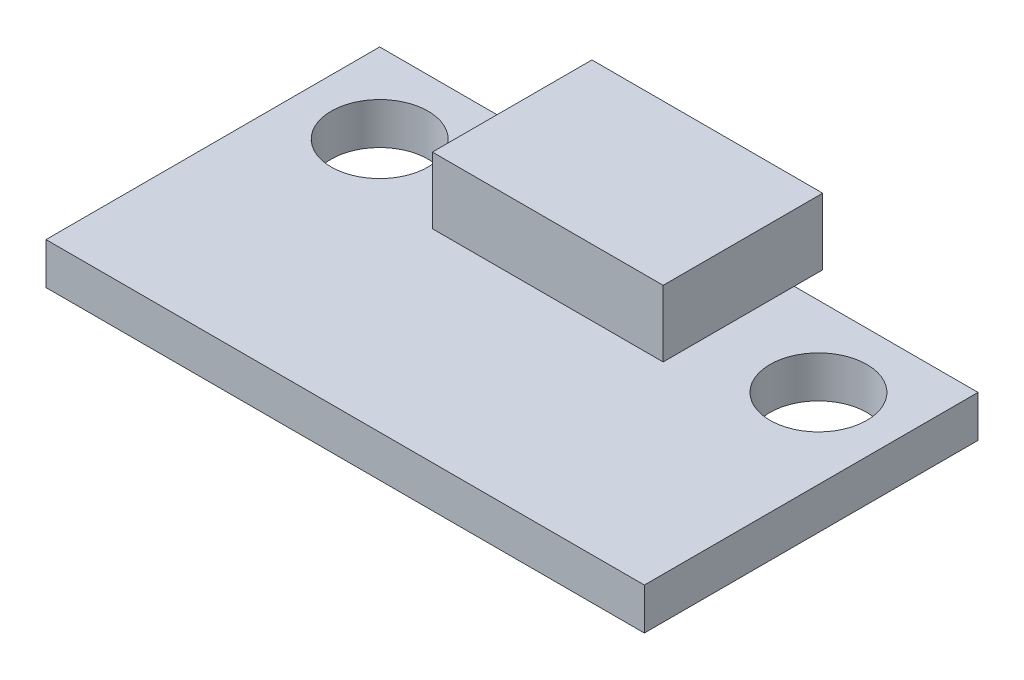
ISO-10303-21;
HEADER;
FILE_DESCRIPTION(('STEP AP214'),'2;1');
FILE_NAME('part.step','',(''),(''),'','','');
FILE_SCHEMA(('AUTOMOTIVE_DESIGN { 1 0 10303 214 1 1 1 1 }'));
ENDSEC;
DATA;
#1=APPLICATION_CONTEXT('core data for automotive mechanical design processes');
#2=APPLICATION_PROTOCOL_DEFINITION('international standard','automotive_design',2000,#1);
#3=PRODUCT_CONTEXT('',#1,'mechanical');
#4=PRODUCT('Part','Part','',(#3));
#5=PRODUCT_RELATED_PRODUCT_CATEGORY('part','',(#4));
#6=PRODUCT_DEFINITION_FORMATION('','',#4);
#7=PRODUCT_DEFINITION_CONTEXT('part definition',#1,'design');
#8=PRODUCT_DEFINITION('design','',#6,#7);
#9=PRODUCT_DEFINITION_SHAPE('','',#8);
#10=(LENGTH_UNIT() NAMED_UNIT(*) SI_UNIT(.MILLI.,.METRE.));
#11=(NAMED_UNIT(*) PLANE_ANGLE_UNIT() SI_UNIT($,.RADIAN.));
#12=(NAMED_UNIT(*) SI_UNIT($,.STERADIAN.) SOLID_ANGLE_UNIT());
#13=UNCERTAINTY_MEASURE_WITH_UNIT(LENGTH_MEASURE(1.E-05),#10,'distance_accuracy_value','');
#14=(GEOMETRIC_REPRESENTATION_CONTEXT(3) GLOBAL_UNCERTAINTY_ASSIGNED_CONTEXT((#13)) GLOBAL_UNIT_ASSIGNED_CONTEXT((#10,
#11,#12)) REPRESENTATION_CONTEXT('',''));
#15=CARTESIAN_POINT('',(0.,0.,0.));
#16=DIRECTION('',(0.,0.,1.));
#17=DIRECTION('',(1.,0.,0.));
#18=AXIS2_PLACEMENT_3D('',#15,#16,#17);
#19=CARTESIAN_POINT('',(0.,1.46,0.));
#20=DIRECTION('',(0.,-1.,0.));
#21=DIRECTION('',(0.,0.,-1.));
#22=AXIS2_PLACEMENT_3D('',#19,#20,#21);
#23=PLANE('',#22);
#24=CARTESIAN_POINT('',(7.7,1.46,-3.055));
#25=DIRECTION('',(0.,1.,0.));
#26=DIRECTION('',(0.,0.,-1.));
#27=AXIS2_PLACEMENT_3D('',#24,#25,#26);
#28=CIRCLE('',#27,1.7);
#29=CARTESIAN_POINT('',(7.7,1.46,-4.755));
#30=VERTEX_POINT('',#29);
#31=EDGE_CURVE('E128',#30,#30,#28,.T.);
#32=ORIENTED_EDGE('',*,*,#31,.F.);
#33=EDGE_LOOP('',(#32));
#34=FACE_BOUND('',#33,.T.);
#35=CARTESIAN_POINT('',(-7.7,1.46,-3.055));
#36=DIRECTION('',(0.,1.,0.));
#37=DIRECTION('',(0.,0.,1.));
#38=AXIS2_PLACEMENT_3D('',#35,#36,#37);
#39=CIRCLE('',#38,1.7);
#40=CARTESIAN_POINT('',(-7.7,1.46,-1.355));
#41=VERTEX_POINT('',#40);
#42=EDGE_CURVE('E137',#41,#41,#39,.T.);
#43=ORIENTED_EDGE('',*,*,#42,.F.);
#44=EDGE_LOOP('',(#43));
#45=FACE_BOUND('',#44,.T.);
#46=DIRECTION('',(0.,0.,1.));
#47=VECTOR('',#46,1.);
#48=CARTESIAN_POINT('',(-4.05,1.46,-6.855));
#49=LINE('',#48,#47);
#50=CARTESIAN_POINT('',(-4.05,1.46,-5.855));
#51=VERTEX_POINT('',#50);
#52=CARTESIAN_POINT('',(-4.05,1.46,-1.255));
#53=VERTEX_POINT('',#52);
#54=EDGE_CURVE('E11',#51,#53,#49,.T.);
#55=ORIENTED_EDGE('',*,*,#54,.F.);
#56=DIRECTION('',(-1.,0.,0.));
#57=VECTOR('',#56,1.);
#58=CARTESIAN_POINT('',(10.5,1.46,-5.855));
#59=LINE('',#58,#57);
#60=CARTESIAN_POINT('',(-10.5,1.46,-5.855));
#61=VERTEX_POINT('',#60);
#62=EDGE_CURVE('E151',#51,#61,#59,.T.);
#63=ORIENTED_EDGE('',*,*,#62,.T.);
#64=DIRECTION('',(0.,0.,1.));
#65=VECTOR('',#64,1.);
#66=CARTESIAN_POINT('',(-10.5,1.46,-5.855));
#67=LINE('',#66,#65);
#68=CARTESIAN_POINT('',(-10.5,1.46,5.855));
#69=VERTEX_POINT('',#68);
#70=EDGE_CURVE('E143',#61,#69,#67,.T.);
#71=ORIENTED_EDGE('',*,*,#70,.T.);
#72=DIRECTION('',(1.,0.,0.));
#73=VECTOR('',#72,1.);
#74=CARTESIAN_POINT('',(10.5,1.46,5.855));
#75=LINE('',#74,#73);
#76=CARTESIAN_POINT('',(10.5,1.46,5.855));
#77=VERTEX_POINT('',#76);
#78=EDGE_CURVE('E146',#69,#77,#75,.T.);
#79=ORIENTED_EDGE('',*,*,#78,.T.);
#80=DIRECTION('',(0.,0.,-1.));
#81=VECTOR('',#80,1.);
#82=CARTESIAN_POINT('',(10.5,1.46,-5.855));
#83=LINE('',#82,#81);
#84=CARTESIAN_POINT('',(10.5,1.46,-5.855));
#85=VERTEX_POINT('',#84);
#86=EDGE_CURVE('E149',#77,#85,#83,.T.);
#87=ORIENTED_EDGE('',*,*,#86,.T.);
#88=CARTESIAN_POINT('',(4.05,1.46,-5.855));
#89=VERTEX_POINT('',#88);
#90=EDGE_CURVE('E152',#85,#89,#59,.T.);
#91=ORIENTED_EDGE('',*,*,#90,.T.);
#92=DIRECTION('',(0.,0.,-1.));
#93=VECTOR('',#92,1.);
#94=CARTESIAN_POINT('',(4.05,1.46,-6.855));
#95=LINE('',#94,#93);
#96=CARTESIAN_POINT('',(4.05,1.46,-1.255));
#97=VERTEX_POINT('',#96);
#98=EDGE_CURVE('E194',#97,#89,#95,.T.);
#99=ORIENTED_EDGE('',*,*,#98,.F.);
#100=DIRECTION('',(1.,0.,0.));
#101=VECTOR('',#100,1.);
#102=CARTESIAN_POINT('',(-4.05,1.46,-1.255));
#103=LINE('',#102,#101);
#104=EDGE_CURVE('E50',#53,#97,#103,.T.);
#105=ORIENTED_EDGE('',*,*,#104,.F.);
#106=EDGE_LOOP('',(#55,#63,#71,#79,#87,#91,#99,#105));
#107=FACE_BOUND('',#106,.T.);
#108=ADVANCED_FACE('F33',(#34,#45,#107),#23,.F.);
#109=CARTESIAN_POINT('',(0.,0.,0.));
#110=DIRECTION('',(0.,-1.,0.));
#111=DIRECTION('',(0.,0.,-1.));
#112=AXIS2_PLACEMENT_3D('',#109,#110,#111);
#113=PLANE('',#112);
#114=CARTESIAN_POINT('',(-7.7,0.,-3.055));
#115=DIRECTION('',(0.,1.,0.));
#116=DIRECTION('',(0.,0.,1.));
#117=AXIS2_PLACEMENT_3D('',#114,#115,#116);
#118=CIRCLE('',#117,1.7);
#119=CARTESIAN_POINT('',(-7.7,0.,-1.355));
#120=VERTEX_POINT('',#119);
#121=EDGE_CURVE('E135',#120,#120,#118,.T.);
#122=ORIENTED_EDGE('',*,*,#121,.T.);
#123=EDGE_LOOP('',(#122));
#124=FACE_BOUND('',#123,.T.);
#125=DIRECTION('',(0.,0.,1.));
#126=VECTOR('',#125,1.);
#127=CARTESIAN_POINT('',(-10.5,0.,-5.855));
#128=LINE('',#127,#126);
#129=CARTESIAN_POINT('',(-10.5,0.,-5.855));
#130=VERTEX_POINT('',#129);
#131=CARTESIAN_POINT('',(-10.5,0.,5.855));
#132=VERTEX_POINT('',#131);
#133=EDGE_CURVE('E140',#130,#132,#128,.T.);
#134=ORIENTED_EDGE('',*,*,#133,.F.);
#135=DIRECTION('',(-1.,0.,0.));
#136=VECTOR('',#135,1.);
#137=CARTESIAN_POINT('',(10.5,0.,-5.855));
#138=LINE('',#137,#136);
#139=CARTESIAN_POINT('',(10.5,0.,-5.855));
#140=VERTEX_POINT('',#139);
#141=EDGE_CURVE('E147',#140,#130,#138,.T.);
#142=ORIENTED_EDGE('',*,*,#141,.F.);
#143=DIRECTION('',(0.,0.,-1.));
#144=VECTOR('',#143,1.);
#145=CARTESIAN_POINT('',(10.5,0.,-5.855));
#146=LINE('',#145,#144);
#147=CARTESIAN_POINT('',(10.5,0.,5.855));
#148=VERTEX_POINT('',#147);
#149=EDGE_CURVE('E161',#148,#140,#146,.T.);
#150=ORIENTED_EDGE('',*,*,#149,.F.);
#151=DIRECTION('',(1.,0.,0.));
#152=VECTOR('',#151,1.);
#153=CARTESIAN_POINT('',(10.5,0.,5.855));
#154=LINE('',#153,#152);
#155=EDGE_CURVE('E159',#132,#148,#154,.T.);
#156=ORIENTED_EDGE('',*,*,#155,.F.);
#157=EDGE_LOOP('',(#134,#142,#150,#156));
#158=FACE_BOUND('',#157,.T.);
#159=CARTESIAN_POINT('',(7.7,0.,-3.055));
#160=DIRECTION('',(0.,1.,0.));
#161=DIRECTION('',(0.,0.,-1.));
#162=AXIS2_PLACEMENT_3D('',#159,#160,#161);
#163=CIRCLE('',#162,1.7);
#164=CARTESIAN_POINT('',(7.7,0.,-4.755));
#165=VERTEX_POINT('',#164);
#166=EDGE_CURVE('E125',#165,#165,#163,.T.);
#167=ORIENTED_EDGE('',*,*,#166,.T.);
#168=EDGE_LOOP('',(#167));
#169=FACE_BOUND('',#168,.T.);
#170=ADVANCED_FACE('F184',(#124,#158,#169),#113,.T.);
#171=CARTESIAN_POINT('',(-10.5,1.46,-5.855));
#172=DIRECTION('',(1.,0.,0.));
#173=DIRECTION('',(0.,0.,-1.));
#174=AXIS2_PLACEMENT_3D('',#171,#172,#173);
#175=PLANE('',#174);
#176=ORIENTED_EDGE('',*,*,#133,.T.);
#177=DIRECTION('',(0.,-1.,0.));
#178=VECTOR('',#177,1.);
#179=CARTESIAN_POINT('',(-10.5,1.46,5.855));
#180=LINE('',#179,#178);
#181=EDGE_CURVE('E37',#69,#132,#180,.T.);
#182=ORIENTED_EDGE('',*,*,#181,.F.);
#183=ORIENTED_EDGE('',*,*,#70,.F.);
#184=DIRECTION('',(0.,-1.,0.));
#185=VECTOR('',#184,1.);
#186=CARTESIAN_POINT('',(-10.5,1.46,-5.855));
#187=LINE('',#186,#185);
#188=EDGE_CURVE('E155',#61,#130,#187,.T.);
#189=ORIENTED_EDGE('',*,*,#188,.T.);
#190=EDGE_LOOP('',(#176,#182,#183,#189));
#191=FACE_BOUND('',#190,.T.);
#192=ADVANCED_FACE('F35',(#191),#175,.F.);
#193=CARTESIAN_POINT('',(10.5,1.46,5.855));
#194=DIRECTION('',(0.,0.,-1.));
#195=DIRECTION('',(-1.,0.,0.));
#196=AXIS2_PLACEMENT_3D('',#193,#194,#195);
#197=PLANE('',#196);
#198=ORIENTED_EDGE('',*,*,#155,.T.);
#199=DIRECTION('',(0.,-1.,0.));
#200=VECTOR('',#199,1.);
#201=CARTESIAN_POINT('',(10.5,1.46,5.855));
#202=LINE('',#201,#200);
#203=EDGE_CURVE('E168',#77,#148,#202,.T.);
#204=ORIENTED_EDGE('',*,*,#203,.F.);
#205=ORIENTED_EDGE('',*,*,#78,.F.);
#206=ORIENTED_EDGE('',*,*,#181,.T.);
#207=EDGE_LOOP('',(#198,#204,#205,#206));
#208=FACE_BOUND('',#207,.T.);
#209=ADVANCED_FACE('F177',(#208),#197,.F.);
#210=CARTESIAN_POINT('',(10.5,1.46,-5.855));
#211=DIRECTION('',(-1.,0.,0.));
#212=DIRECTION('',(0.,0.,1.));
#213=AXIS2_PLACEMENT_3D('',#210,#211,#212);
#214=PLANE('',#213);
#215=ORIENTED_EDGE('',*,*,#149,.T.);
#216=DIRECTION('',(0.,-1.,0.));
#217=VECTOR('',#216,1.);
#218=CARTESIAN_POINT('',(10.5,1.46,-5.855));
#219=LINE('',#218,#217);
#220=EDGE_CURVE('E166',#85,#140,#219,.T.);
#221=ORIENTED_EDGE('',*,*,#220,.F.);
#222=ORIENTED_EDGE('',*,*,#86,.F.);
#223=ORIENTED_EDGE('',*,*,#203,.T.);
#224=EDGE_LOOP('',(#215,#221,#222,#223));
#225=FACE_BOUND('',#224,.T.);
#226=ADVANCED_FACE('F187',(#225),#214,.F.);
#227=CARTESIAN_POINT('',(10.5,1.46,-5.855));
#228=DIRECTION('',(0.,0.,1.));
#229=DIRECTION('',(1.,0.,0.));
#230=AXIS2_PLACEMENT_3D('',#227,#228,#229);
#231=PLANE('',#230);
#232=ORIENTED_EDGE('',*,*,#141,.T.);
#233=ORIENTED_EDGE('',*,*,#188,.F.);
#234=ORIENTED_EDGE('',*,*,#62,.F.);
#235=EDGE_CURVE('E156',#89,#51,#59,.T.);
#236=ORIENTED_EDGE('',*,*,#235,.F.);
#237=ORIENTED_EDGE('',*,*,#90,.F.);
#238=ORIENTED_EDGE('',*,*,#220,.T.);
#239=EDGE_LOOP('',(#232,#233,#234,#236,#237,#238));
#240=FACE_BOUND('',#239,.T.);
#241=ADVANCED_FACE('F190',(#240),#231,.F.);
#242=CARTESIAN_POINT('',(-7.7,1.46,-3.055));
#243=DIRECTION('',(0.,-1.,0.));
#244=DIRECTION('',(0.,0.,-1.));
#245=AXIS2_PLACEMENT_3D('',#242,#243,#244);
#246=CYLINDRICAL_SURFACE('',#245,1.7);
#247=ORIENTED_EDGE('',*,*,#42,.T.);
#248=EDGE_LOOP('',(#247));
#249=FACE_BOUND('',#248,.T.);
#250=ORIENTED_EDGE('',*,*,#121,.F.);
#251=EDGE_LOOP('',(#250));
#252=FACE_BOUND('',#251,.T.);
#253=ADVANCED_FACE('F233',(#249,#252),#246,.F.);
#254=CARTESIAN_POINT('',(7.7,1.46,-3.055));
#255=DIRECTION('',(0.,-1.,0.));
#256=DIRECTION('',(0.,0.,-1.));
#257=AXIS2_PLACEMENT_3D('',#254,#255,#256);
#258=CYLINDRICAL_SURFACE('',#257,1.7);
#259=ORIENTED_EDGE('',*,*,#31,.T.);
#260=EDGE_LOOP('',(#259));
#261=FACE_BOUND('',#260,.T.);
#262=ORIENTED_EDGE('',*,*,#166,.F.);
#263=EDGE_LOOP('',(#262));
#264=FACE_BOUND('',#263,.T.);
#265=ADVANCED_FACE('F276',(#261,#264),#258,.F.);
#266=CARTESIAN_POINT('',(0.,1.46,0.));
#267=DIRECTION('',(0.,1.,0.));
#268=DIRECTION('',(0.,0.,1.));
#269=AXIS2_PLACEMENT_3D('',#266,#267,#268);
#270=PLANE('',#269);
#271=CARTESIAN_POINT('',(4.05,1.46,-6.855));
#272=VERTEX_POINT('',#271);
#273=EDGE_CURVE('E197',#89,#272,#95,.T.);
#274=ORIENTED_EDGE('',*,*,#273,.F.);
#275=ORIENTED_EDGE('',*,*,#235,.T.);
#276=CARTESIAN_POINT('',(-4.05,1.46,-6.855));
#277=VERTEX_POINT('',#276);
#278=EDGE_CURVE('E43',#277,#51,#49,.T.);
#279=ORIENTED_EDGE('',*,*,#278,.F.);
#280=DIRECTION('',(-1.,0.,0.));
#281=VECTOR('',#280,1.);
#282=CARTESIAN_POINT('',(-4.05,1.46,-6.855));
#283=LINE('',#282,#281);
#284=EDGE_CURVE('E121',#272,#277,#283,.T.);
#285=ORIENTED_EDGE('',*,*,#284,.F.);
#286=EDGE_LOOP('',(#274,#275,#279,#285));
#287=FACE_BOUND('',#286,.T.);
#288=ADVANCED_FACE('F198',(#287),#270,.F.);
#289=CARTESIAN_POINT('',(-4.05,3.79,-6.855));
#290=DIRECTION('',(1.,0.,0.));
#291=DIRECTION('',(0.,0.,-1.));
#292=AXIS2_PLACEMENT_3D('',#289,#290,#291);
#293=PLANE('',#292);
#294=ORIENTED_EDGE('',*,*,#278,.T.);
#295=ORIENTED_EDGE('',*,*,#54,.T.);
#296=DIRECTION('',(0.,-1.,0.));
#297=VECTOR('',#296,1.);
#298=CARTESIAN_POINT('',(-4.05,3.79,-1.255));
#299=LINE('',#298,#297);
#300=CARTESIAN_POINT('',(-4.05,3.79,-1.255));
#301=VERTEX_POINT('',#300);
#302=EDGE_CURVE('E106',#301,#53,#299,.T.);
#303=ORIENTED_EDGE('',*,*,#302,.F.);
#304=DIRECTION('',(0.,0.,1.));
#305=VECTOR('',#304,1.);
#306=CARTESIAN_POINT('',(-4.05,3.79,-6.855));
#307=LINE('',#306,#305);
#308=CARTESIAN_POINT('',(-4.05,3.79,-6.855));
#309=VERTEX_POINT('',#308);
#310=EDGE_CURVE('E112',#309,#301,#307,.T.);
#311=ORIENTED_EDGE('',*,*,#310,.F.);
#312=DIRECTION('',(0.,-1.,0.));
#313=VECTOR('',#312,1.);
#314=CARTESIAN_POINT('',(-4.05,3.79,-6.855));
#315=LINE('',#314,#313);
#316=EDGE_CURVE('E208',#309,#277,#315,.T.);
#317=ORIENTED_EDGE('',*,*,#316,.T.);
#318=EDGE_LOOP('',(#294,#295,#303,#311,#317));
#319=FACE_BOUND('',#318,.T.);
#320=ADVANCED_FACE('F124',(#319),#293,.F.);
#321=CARTESIAN_POINT('',(-4.05,3.79,-1.255));
#322=DIRECTION('',(0.,0.,-1.));
#323=DIRECTION('',(-1.,0.,0.));
#324=AXIS2_PLACEMENT_3D('',#321,#322,#323);
#325=PLANE('',#324);
#326=ORIENTED_EDGE('',*,*,#104,.T.);
#327=DIRECTION('',(0.,-1.,0.));
#328=VECTOR('',#327,1.);
#329=CARTESIAN_POINT('',(4.05,3.79,-1.255));
#330=LINE('',#329,#328);
#331=CARTESIAN_POINT('',(4.05,3.79,-1.255));
#332=VERTEX_POINT('',#331);
#333=EDGE_CURVE('E108',#332,#97,#330,.T.);
#334=ORIENTED_EDGE('',*,*,#333,.F.);
#335=DIRECTION('',(1.,0.,0.));
#336=VECTOR('',#335,1.);
#337=CARTESIAN_POINT('',(-4.05,3.79,-1.255));
#338=LINE('',#337,#336);
#339=EDGE_CURVE('E102',#301,#332,#338,.T.);
#340=ORIENTED_EDGE('',*,*,#339,.F.);
#341=ORIENTED_EDGE('',*,*,#302,.T.);
#342=EDGE_LOOP('',(#326,#334,#340,#341));
#343=FACE_BOUND('',#342,.T.);
#344=ADVANCED_FACE('F104',(#343),#325,.F.);
#345=CARTESIAN_POINT('',(4.05,3.79,-6.855));
#346=DIRECTION('',(-1.,0.,0.));
#347=DIRECTION('',(0.,0.,1.));
#348=AXIS2_PLACEMENT_3D('',#345,#346,#347);
#349=PLANE('',#348);
#350=ORIENTED_EDGE('',*,*,#98,.T.);
#351=ORIENTED_EDGE('',*,*,#273,.T.);
#352=DIRECTION('',(0.,-1.,0.));
#353=VECTOR('',#352,1.);
#354=CARTESIAN_POINT('',(4.05,3.79,-6.855));
#355=LINE('',#354,#353);
#356=CARTESIAN_POINT('',(4.05,3.79,-6.855));
#357=VERTEX_POINT('',#356);
#358=EDGE_CURVE('E130',#357,#272,#355,.T.);
#359=ORIENTED_EDGE('',*,*,#358,.F.);
#360=DIRECTION('',(0.,0.,-1.));
#361=VECTOR('',#360,1.);
#362=CARTESIAN_POINT('',(4.05,3.79,-6.855));
#363=LINE('',#362,#361);
#364=EDGE_CURVE('E111',#332,#357,#363,.T.);
#365=ORIENTED_EDGE('',*,*,#364,.F.);
#366=ORIENTED_EDGE('',*,*,#333,.T.);
#367=EDGE_LOOP('',(#350,#351,#359,#365,#366));
#368=FACE_BOUND('',#367,.T.);
#369=ADVANCED_FACE('F204',(#368),#349,.F.);
#370=CARTESIAN_POINT('',(-4.05,3.79,-6.855));
#371=DIRECTION('',(0.,0.,1.));
#372=DIRECTION('',(1.,0.,0.));
#373=AXIS2_PLACEMENT_3D('',#370,#371,#372);
#374=PLANE('',#373);
#375=ORIENTED_EDGE('',*,*,#284,.T.);
#376=ORIENTED_EDGE('',*,*,#316,.F.);
#377=DIRECTION('',(-1.,0.,0.));
#378=VECTOR('',#377,1.);
#379=CARTESIAN_POINT('',(-4.05,3.79,-6.855));
#380=LINE('',#379,#378);
#381=EDGE_CURVE('E117',#357,#309,#380,.T.);
#382=ORIENTED_EDGE('',*,*,#381,.F.);
#383=ORIENTED_EDGE('',*,*,#358,.T.);
#384=EDGE_LOOP('',(#375,#376,#382,#383));
#385=FACE_BOUND('',#384,.T.);
#386=ADVANCED_FACE('F210',(#385),#374,.F.);
#387=CARTESIAN_POINT('',(0.,3.79,0.));
#388=DIRECTION('',(0.,1.,0.));
#389=DIRECTION('',(0.,0.,1.));
#390=AXIS2_PLACEMENT_3D('',#387,#388,#389);
#391=PLANE('',#390);
#392=ORIENTED_EDGE('',*,*,#310,.T.);
#393=ORIENTED_EDGE('',*,*,#339,.T.);
#394=ORIENTED_EDGE('',*,*,#364,.T.);
#395=ORIENTED_EDGE('',*,*,#381,.T.);
#396=EDGE_LOOP('',(#392,#393,#394,#395));
#397=FACE_BOUND('',#396,.T.);
#398=ADVANCED_FACE('F115',(#397),#391,.T.);
#399=CLOSED_SHELL('',(#108,#170,#192,#209,#226,#241,#253,#265,#288,#320,#344,#369,#386,#398));
#400=MANIFOLD_SOLID_BREP('B2',#399);
#401=ADVANCED_BREP_SHAPE_REPRESENTATION('',(#18,#400),#14);
#402=SHAPE_DEFINITION_REPRESENTATION(#9,#401);
ENDSEC;
END-ISO-10303-21;
